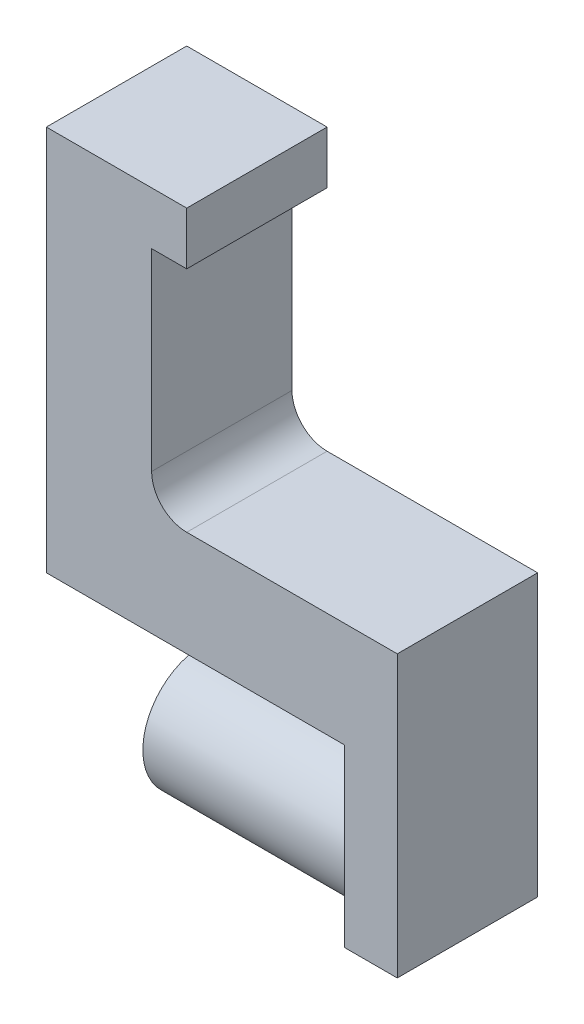
ISO-10303-21;
HEADER;
FILE_DESCRIPTION(('STEP AP214'),'2;1');
FILE_NAME('part.step','',(''),(''),'','','');
FILE_SCHEMA(('AUTOMOTIVE_DESIGN { 1 0 10303 214 1 1 1 1 }'));
ENDSEC;
DATA;
#1=APPLICATION_CONTEXT('core data for automotive mechanical design processes');
#2=APPLICATION_PROTOCOL_DEFINITION('international standard','automotive_design',2000,#1);
#3=PRODUCT_CONTEXT('',#1,'mechanical');
#4=PRODUCT('Part','Part','',(#3));
#5=PRODUCT_RELATED_PRODUCT_CATEGORY('part','',(#4));
#6=PRODUCT_DEFINITION_FORMATION('','',#4);
#7=PRODUCT_DEFINITION_CONTEXT('part definition',#1,'design');
#8=PRODUCT_DEFINITION('design','',#6,#7);
#9=PRODUCT_DEFINITION_SHAPE('','',#8);
#10=(LENGTH_UNIT() NAMED_UNIT(*) SI_UNIT(.MILLI.,.METRE.));
#11=(NAMED_UNIT(*) PLANE_ANGLE_UNIT() SI_UNIT($,.RADIAN.));
#12=(NAMED_UNIT(*) SI_UNIT($,.STERADIAN.) SOLID_ANGLE_UNIT());
#13=UNCERTAINTY_MEASURE_WITH_UNIT(LENGTH_MEASURE(1.E-05),#10,'distance_accuracy_value','');
#14=(GEOMETRIC_REPRESENTATION_CONTEXT(3) GLOBAL_UNCERTAINTY_ASSIGNED_CONTEXT((#13)) GLOBAL_UNIT_ASSIGNED_CONTEXT((#10,
#11,#12)) REPRESENTATION_CONTEXT('',''));
#15=CARTESIAN_POINT('',(0.,0.,0.));
#16=DIRECTION('',(0.,0.,1.));
#17=DIRECTION('',(1.,0.,0.));
#18=AXIS2_PLACEMENT_3D('',#15,#16,#17);
#19=CARTESIAN_POINT('',(-38.1,0.,0.));
#20=DIRECTION('',(1.,0.,0.));
#21=DIRECTION('',(0.,0.,-1.));
#22=AXIS2_PLACEMENT_3D('',#19,#20,#21);
#23=CYLINDRICAL_SURFACE('',#22,11.1125);
#24=CARTESIAN_POINT('',(-38.1,0.,0.));
#25=DIRECTION('',(1.,0.,0.));
#26=DIRECTION('',(0.,0.,-1.));
#27=AXIS2_PLACEMENT_3D('',#24,#25,#26);
#28=CIRCLE('',#27,11.1125);
#29=CARTESIAN_POINT('',(-38.1,0.,-11.1125));
#30=VERTEX_POINT('',#29);
#31=EDGE_CURVE('E217',#30,#30,#28,.T.);
#32=ORIENTED_EDGE('',*,*,#31,.T.);
#33=EDGE_LOOP('',(#32));
#34=FACE_BOUND('',#33,.T.);
#35=CARTESIAN_POINT('',(0.,0.,0.));
#36=DIRECTION('',(1.,0.,0.));
#37=DIRECTION('',(0.,0.,-1.));
#38=AXIS2_PLACEMENT_3D('',#35,#36,#37);
#39=CIRCLE('',#38,11.1125);
#40=CARTESIAN_POINT('',(0.,-11.1125,0.));
#41=VERTEX_POINT('',#40);
#42=EDGE_CURVE('E214',#41,#41,#39,.T.);
#43=ORIENTED_EDGE('',*,*,#42,.F.);
#44=EDGE_LOOP('',(#43));
#45=FACE_BOUND('',#44,.T.);
#46=ADVANCED_FACE('F50',(#34,#45),#23,.T.);
#47=CARTESIAN_POINT('',(-38.1,0.,0.));
#48=DIRECTION('',(1.,0.,0.));
#49=DIRECTION('',(0.,0.,-1.));
#50=AXIS2_PLACEMENT_3D('',#47,#48,#49);
#51=PLANE('',#50);
#52=ORIENTED_EDGE('',*,*,#31,.F.);
#53=EDGE_LOOP('',(#52));
#54=FACE_BOUND('',#53,.T.);
#55=ADVANCED_FACE('F259',(#54),#51,.F.);
#56=CARTESIAN_POINT('',(0.,-11.1125,-12.7));
#57=DIRECTION('',(-1.,0.,0.));
#58=DIRECTION('',(0.,0.,1.));
#59=AXIS2_PLACEMENT_3D('',#56,#57,#58);
#60=PLANE('',#59);
#61=DIRECTION('',(0.,0.,1.));
#62=VECTOR('',#61,1.);
#63=CARTESIAN_POINT('',(0.,-11.1125,-12.7));
#64=LINE('',#63,#62);
#65=CARTESIAN_POINT('',(0.,-11.1125,-12.7));
#66=VERTEX_POINT('',#65);
#67=EDGE_CURVE('E216',#66,#41,#64,.T.);
#68=ORIENTED_EDGE('',*,*,#67,.T.);
#69=ORIENTED_EDGE('',*,*,#42,.T.);
#70=CARTESIAN_POINT('',(0.,-11.1125,12.7));
#71=VERTEX_POINT('',#70);
#72=EDGE_CURVE('E209',#41,#71,#64,.T.);
#73=ORIENTED_EDGE('',*,*,#72,.T.);
#74=DIRECTION('',(0.,-1.,0.));
#75=VECTOR('',#74,1.);
#76=CARTESIAN_POINT('',(0.,-11.1125,12.7));
#77=LINE('',#76,#75);
#78=CARTESIAN_POINT('',(0.,20.6375,12.7));
#79=VERTEX_POINT('',#78);
#80=EDGE_CURVE('E192',#79,#71,#77,.T.);
#81=ORIENTED_EDGE('',*,*,#80,.F.);
#82=DIRECTION('',(0.,0.,1.));
#83=VECTOR('',#82,1.);
#84=CARTESIAN_POINT('',(0.,20.6375,-12.7));
#85=LINE('',#84,#83);
#86=CARTESIAN_POINT('',(0.,20.6375,-12.7));
#87=VERTEX_POINT('',#86);
#88=EDGE_CURVE('E208',#87,#79,#85,.T.);
#89=ORIENTED_EDGE('',*,*,#88,.F.);
#90=DIRECTION('',(0.,-1.,0.));
#91=VECTOR('',#90,1.);
#92=CARTESIAN_POINT('',(0.,-11.1125,-12.7));
#93=LINE('',#92,#91);
#94=EDGE_CURVE('E203',#87,#66,#93,.T.);
#95=ORIENTED_EDGE('',*,*,#94,.T.);
#96=EDGE_LOOP('',(#68,#69,#73,#81,#89,#95));
#97=FACE_BOUND('',#96,.T.);
#98=ADVANCED_FACE('F248',(#97),#60,.T.);
#99=CARTESIAN_POINT('',(9.525,-11.1125,-12.7));
#100=DIRECTION('',(1.,0.,0.));
#101=DIRECTION('',(0.,0.,-1.));
#102=AXIS2_PLACEMENT_3D('',#99,#100,#101);
#103=PLANE('',#102);
#104=DIRECTION('',(0.,1.,0.));
#105=VECTOR('',#104,1.);
#106=CARTESIAN_POINT('',(9.525,-11.1125,-12.7));
#107=LINE('',#106,#105);
#108=CARTESIAN_POINT('',(9.525,-11.1125,-12.7));
#109=VERTEX_POINT('',#108);
#110=CARTESIAN_POINT('',(9.52500000000001,39.6875,-12.7));
#111=VERTEX_POINT('',#110);
#112=EDGE_CURVE('E210',#109,#111,#107,.T.);
#113=ORIENTED_EDGE('',*,*,#112,.T.);
#114=DIRECTION('',(0.,0.,1.));
#115=VECTOR('',#114,1.);
#116=CARTESIAN_POINT('',(9.52500000000001,39.6875,-12.7));
#117=LINE('',#116,#115);
#118=CARTESIAN_POINT('',(9.52500000000001,39.6875,12.7));
#119=VERTEX_POINT('',#118);
#120=EDGE_CURVE('E189',#111,#119,#117,.T.);
#121=ORIENTED_EDGE('',*,*,#120,.T.);
#122=DIRECTION('',(0.,1.,0.));
#123=VECTOR('',#122,1.);
#124=CARTESIAN_POINT('',(9.525,-11.1125,12.7));
#125=LINE('',#124,#123);
#126=CARTESIAN_POINT('',(9.525,-11.1125,12.7));
#127=VERTEX_POINT('',#126);
#128=EDGE_CURVE('E197',#127,#119,#125,.T.);
#129=ORIENTED_EDGE('',*,*,#128,.F.);
#130=DIRECTION('',(0.,0.,1.));
#131=VECTOR('',#130,1.);
#132=CARTESIAN_POINT('',(9.525,-11.1125,-12.7));
#133=LINE('',#132,#131);
#134=EDGE_CURVE('E211',#109,#127,#133,.T.);
#135=ORIENTED_EDGE('',*,*,#134,.F.);
#136=EDGE_LOOP('',(#113,#121,#129,#135));
#137=FACE_BOUND('',#136,.T.);
#138=ADVANCED_FACE('F269',(#137),#103,.T.);
#139=CARTESIAN_POINT('',(0.,-11.1125,-12.7));
#140=DIRECTION('',(0.,-1.,0.));
#141=DIRECTION('',(0.,0.,-1.));
#142=AXIS2_PLACEMENT_3D('',#139,#140,#141);
#143=PLANE('',#142);
#144=ORIENTED_EDGE('',*,*,#134,.T.);
#145=DIRECTION('',(1.,0.,0.));
#146=VECTOR('',#145,1.);
#147=CARTESIAN_POINT('',(0.,-11.1125,12.7));
#148=LINE('',#147,#146);
#149=EDGE_CURVE('E196',#71,#127,#148,.T.);
#150=ORIENTED_EDGE('',*,*,#149,.F.);
#151=ORIENTED_EDGE('',*,*,#72,.F.);
#152=ORIENTED_EDGE('',*,*,#67,.F.);
#153=DIRECTION('',(1.,0.,0.));
#154=VECTOR('',#153,1.);
#155=CARTESIAN_POINT('',(0.,-11.1125,-12.7));
#156=LINE('',#155,#154);
#157=EDGE_CURVE('E204',#66,#109,#156,.T.);
#158=ORIENTED_EDGE('',*,*,#157,.T.);
#159=EDGE_LOOP('',(#144,#150,#151,#152,#158));
#160=FACE_BOUND('',#159,.T.);
#161=ADVANCED_FACE('F254',(#160),#143,.T.);
#162=CARTESIAN_POINT('',(0.,0.,-12.7));
#163=DIRECTION('',(0.,0.,-1.));
#164=DIRECTION('',(-1.,0.,0.));
#165=AXIS2_PLACEMENT_3D('',#162,#163,#164);
#166=PLANE('',#165);
#167=DIRECTION('',(-1.,0.,0.));
#168=VECTOR('',#167,1.);
#169=CARTESIAN_POINT('',(-53.975,90.4875,-12.7));
#170=LINE('',#169,#168);
#171=CARTESIAN_POINT('',(-28.575,90.4875,-12.7));
#172=VERTEX_POINT('',#171);
#173=CARTESIAN_POINT('',(-53.975,90.4875,-12.7));
#174=VERTEX_POINT('',#173);
#175=EDGE_CURVE('E169',#172,#174,#170,.T.);
#176=ORIENTED_EDGE('',*,*,#175,.F.);
#177=DIRECTION('',(0.,1.,0.));
#178=VECTOR('',#177,1.);
#179=CARTESIAN_POINT('',(-28.575,80.9625,-12.7));
#180=LINE('',#179,#178);
#181=CARTESIAN_POINT('',(-28.575,80.9625,-12.7));
#182=VERTEX_POINT('',#181);
#183=EDGE_CURVE('E152',#182,#172,#180,.T.);
#184=ORIENTED_EDGE('',*,*,#183,.F.);
#185=DIRECTION('',(1.,0.,0.));
#186=VECTOR('',#185,1.);
#187=CARTESIAN_POINT('',(-41.23944,80.9625,-12.7));
#188=LINE('',#187,#186);
#189=CARTESIAN_POINT('',(-34.925,80.9625,-12.7));
#190=VERTEX_POINT('',#189);
#191=EDGE_CURVE('E146',#190,#182,#188,.T.);
#192=ORIENTED_EDGE('',*,*,#191,.F.);
#193=DIRECTION('',(0.,1.,0.));
#194=VECTOR('',#193,1.);
#195=CARTESIAN_POINT('',(-34.925,20.6375,-12.7));
#196=LINE('',#195,#194);
#197=CARTESIAN_POINT('',(-34.925,46.0375,-12.7));
#198=VERTEX_POINT('',#197);
#199=EDGE_CURVE('E170',#198,#190,#196,.T.);
#200=ORIENTED_EDGE('',*,*,#199,.F.);
#201=CARTESIAN_POINT('',(-28.575,46.0375,-12.7));
#202=DIRECTION('',(0.,0.,-1.));
#203=DIRECTION('',(-1.,0.,0.));
#204=AXIS2_PLACEMENT_3D('',#201,#202,#203);
#205=CIRCLE('',#204,6.35);
#206=CARTESIAN_POINT('',(-28.575,39.6875,-12.7));
#207=VERTEX_POINT('',#206);
#208=EDGE_CURVE('E54',#198,#207,#205,.F.);
#209=ORIENTED_EDGE('',*,*,#208,.T.);
#210=DIRECTION('',(-1.,0.,0.));
#211=VECTOR('',#210,1.);
#212=CARTESIAN_POINT('',(-53.975,39.6875,-12.7));
#213=LINE('',#212,#211);
#214=EDGE_CURVE('E184',#111,#207,#213,.T.);
#215=ORIENTED_EDGE('',*,*,#214,.F.);
#216=ORIENTED_EDGE('',*,*,#112,.F.);
#217=ORIENTED_EDGE('',*,*,#157,.F.);
#218=ORIENTED_EDGE('',*,*,#94,.F.);
#219=DIRECTION('',(1.,0.,0.));
#220=VECTOR('',#219,1.);
#221=CARTESIAN_POINT('',(-53.975,20.6375,-12.7));
#222=LINE('',#221,#220);
#223=CARTESIAN_POINT('',(-53.975,20.6375,-12.7));
#224=VERTEX_POINT('',#223);
#225=EDGE_CURVE('E182',#224,#87,#222,.T.);
#226=ORIENTED_EDGE('',*,*,#225,.F.);
#227=DIRECTION('',(0.,-1.,0.));
#228=VECTOR('',#227,1.);
#229=CARTESIAN_POINT('',(-53.975,20.6375,-12.7));
#230=LINE('',#229,#228);
#231=EDGE_CURVE('E181',#174,#224,#230,.T.);
#232=ORIENTED_EDGE('',*,*,#231,.F.);
#233=EDGE_LOOP('',(#176,#184,#192,#200,#209,#215,#216,#217,#218,#226,#232));
#234=FACE_BOUND('',#233,.T.);
#235=ADVANCED_FACE('F234',(#234),#166,.T.);
#236=CARTESIAN_POINT('',(0.,0.,12.7));
#237=DIRECTION('',(0.,0.,-1.));
#238=DIRECTION('',(-1.,0.,0.));
#239=AXIS2_PLACEMENT_3D('',#236,#237,#238);
#240=PLANE('',#239);
#241=DIRECTION('',(-1.,0.,0.));
#242=VECTOR('',#241,1.);
#243=CARTESIAN_POINT('',(-53.975,39.6875,12.7));
#244=LINE('',#243,#242);
#245=CARTESIAN_POINT('',(-28.575,39.6875,12.7));
#246=VERTEX_POINT('',#245);
#247=EDGE_CURVE('E177',#119,#246,#244,.T.);
#248=ORIENTED_EDGE('',*,*,#247,.T.);
#249=CARTESIAN_POINT('',(-28.575,46.0375,12.7));
#250=DIRECTION('',(0.,0.,-1.));
#251=DIRECTION('',(-1.,0.,0.));
#252=AXIS2_PLACEMENT_3D('',#249,#250,#251);
#253=CIRCLE('',#252,6.35);
#254=CARTESIAN_POINT('',(-34.925,46.0375,12.7));
#255=VERTEX_POINT('',#254);
#256=EDGE_CURVE('E11',#246,#255,#253,.T.);
#257=ORIENTED_EDGE('',*,*,#256,.T.);
#258=DIRECTION('',(0.,1.,0.));
#259=VECTOR('',#258,1.);
#260=CARTESIAN_POINT('',(-34.925,20.6375,12.7));
#261=LINE('',#260,#259);
#262=CARTESIAN_POINT('',(-34.925,80.9625,12.7));
#263=VERTEX_POINT('',#262);
#264=EDGE_CURVE('E137',#255,#263,#261,.T.);
#265=ORIENTED_EDGE('',*,*,#264,.T.);
#266=DIRECTION('',(1.,0.,0.));
#267=VECTOR('',#266,1.);
#268=CARTESIAN_POINT('',(-41.23944,80.9625,12.7));
#269=LINE('',#268,#267);
#270=CARTESIAN_POINT('',(-28.575,80.9625,12.7));
#271=VERTEX_POINT('',#270);
#272=EDGE_CURVE('E133',#263,#271,#269,.T.);
#273=ORIENTED_EDGE('',*,*,#272,.T.);
#274=DIRECTION('',(0.,1.,0.));
#275=VECTOR('',#274,1.);
#276=CARTESIAN_POINT('',(-28.575,80.9625,12.7));
#277=LINE('',#276,#275);
#278=CARTESIAN_POINT('',(-28.575,90.4875,12.7));
#279=VERTEX_POINT('',#278);
#280=EDGE_CURVE('E136',#271,#279,#277,.T.);
#281=ORIENTED_EDGE('',*,*,#280,.T.);
#282=DIRECTION('',(-1.,0.,0.));
#283=VECTOR('',#282,1.);
#284=CARTESIAN_POINT('',(-53.975,90.4875,12.7));
#285=LINE('',#284,#283);
#286=CARTESIAN_POINT('',(-53.975,90.4875,12.7));
#287=VERTEX_POINT('',#286);
#288=EDGE_CURVE('E164',#279,#287,#285,.T.);
#289=ORIENTED_EDGE('',*,*,#288,.T.);
#290=DIRECTION('',(0.,-1.,0.));
#291=VECTOR('',#290,1.);
#292=CARTESIAN_POINT('',(-53.975,20.6375,12.7));
#293=LINE('',#292,#291);
#294=CARTESIAN_POINT('',(-53.975,20.6375,12.7));
#295=VERTEX_POINT('',#294);
#296=EDGE_CURVE('E174',#287,#295,#293,.T.);
#297=ORIENTED_EDGE('',*,*,#296,.T.);
#298=DIRECTION('',(1.,0.,0.));
#299=VECTOR('',#298,1.);
#300=CARTESIAN_POINT('',(-53.975,20.6375,12.7));
#301=LINE('',#300,#299);
#302=EDGE_CURVE('E180',#295,#79,#301,.T.);
#303=ORIENTED_EDGE('',*,*,#302,.T.);
#304=ORIENTED_EDGE('',*,*,#80,.T.);
#305=ORIENTED_EDGE('',*,*,#149,.T.);
#306=ORIENTED_EDGE('',*,*,#128,.T.);
#307=EDGE_LOOP('',(#248,#257,#265,#273,#281,#289,#297,#303,#304,#305,#306));
#308=FACE_BOUND('',#307,.T.);
#309=ADVANCED_FACE('F134',(#308),#240,.F.);
#310=CARTESIAN_POINT('',(-53.975,20.6375,-12.7));
#311=DIRECTION('',(-1.,0.,0.));
#312=DIRECTION('',(0.,0.,1.));
#313=AXIS2_PLACEMENT_3D('',#310,#311,#312);
#314=PLANE('',#313);
#315=DIRECTION('',(0.,0.,1.));
#316=VECTOR('',#315,1.);
#317=CARTESIAN_POINT('',(-53.975,20.6375,-12.7));
#318=LINE('',#317,#316);
#319=EDGE_CURVE('E190',#224,#295,#318,.T.);
#320=ORIENTED_EDGE('',*,*,#319,.T.);
#321=ORIENTED_EDGE('',*,*,#296,.F.);
#322=DIRECTION('',(0.,0.,1.));
#323=VECTOR('',#322,1.);
#324=CARTESIAN_POINT('',(-53.975,90.4875,-12.7));
#325=LINE('',#324,#323);
#326=EDGE_CURVE('E175',#174,#287,#325,.T.);
#327=ORIENTED_EDGE('',*,*,#326,.F.);
#328=ORIENTED_EDGE('',*,*,#231,.T.);
#329=EDGE_LOOP('',(#320,#321,#327,#328));
#330=FACE_BOUND('',#329,.T.);
#331=ADVANCED_FACE('F243',(#330),#314,.T.);
#332=CARTESIAN_POINT('',(-53.975,39.6875,-12.7));
#333=DIRECTION('',(0.,1.,0.));
#334=DIRECTION('',(0.,0.,1.));
#335=AXIS2_PLACEMENT_3D('',#332,#333,#334);
#336=PLANE('',#335);
#337=ORIENTED_EDGE('',*,*,#214,.T.);
#338=DIRECTION('',(0.,0.,-1.));
#339=VECTOR('',#338,1.);
#340=CARTESIAN_POINT('',(-28.575,39.6875,12.7));
#341=LINE('',#340,#339);
#342=EDGE_CURVE('E68',#207,#246,#341,.F.);
#343=ORIENTED_EDGE('',*,*,#342,.T.);
#344=ORIENTED_EDGE('',*,*,#247,.F.);
#345=ORIENTED_EDGE('',*,*,#120,.F.);
#346=EDGE_LOOP('',(#337,#343,#344,#345));
#347=FACE_BOUND('',#346,.T.);
#348=ADVANCED_FACE('F278',(#347),#336,.T.);
#349=CARTESIAN_POINT('',(-53.975,20.6375,-12.7));
#350=DIRECTION('',(0.,-1.,0.));
#351=DIRECTION('',(0.,0.,-1.));
#352=AXIS2_PLACEMENT_3D('',#349,#350,#351);
#353=PLANE('',#352);
#354=ORIENTED_EDGE('',*,*,#88,.T.);
#355=ORIENTED_EDGE('',*,*,#302,.F.);
#356=ORIENTED_EDGE('',*,*,#319,.F.);
#357=ORIENTED_EDGE('',*,*,#225,.T.);
#358=EDGE_LOOP('',(#354,#355,#356,#357));
#359=FACE_BOUND('',#358,.T.);
#360=ADVANCED_FACE('F244',(#359),#353,.T.);
#361=CARTESIAN_POINT('',(-53.975,90.4875,-12.7));
#362=DIRECTION('',(0.,1.,0.));
#363=DIRECTION('',(0.,0.,1.));
#364=AXIS2_PLACEMENT_3D('',#361,#362,#363);
#365=PLANE('',#364);
#366=ORIENTED_EDGE('',*,*,#326,.T.);
#367=ORIENTED_EDGE('',*,*,#288,.F.);
#368=DIRECTION('',(0.,0.,1.));
#369=VECTOR('',#368,1.);
#370=CARTESIAN_POINT('',(-28.575,90.4875,-12.7));
#371=LINE('',#370,#369);
#372=EDGE_CURVE('E153',#172,#279,#371,.T.);
#373=ORIENTED_EDGE('',*,*,#372,.F.);
#374=ORIENTED_EDGE('',*,*,#175,.T.);
#375=EDGE_LOOP('',(#366,#367,#373,#374));
#376=FACE_BOUND('',#375,.T.);
#377=ADVANCED_FACE('F238',(#376),#365,.T.);
#378=CARTESIAN_POINT('',(-34.925,20.6375,-12.7));
#379=DIRECTION('',(1.,0.,0.));
#380=DIRECTION('',(0.,0.,-1.));
#381=AXIS2_PLACEMENT_3D('',#378,#379,#380);
#382=PLANE('',#381);
#383=ORIENTED_EDGE('',*,*,#264,.F.);
#384=DIRECTION('',(0.,0.,-1.));
#385=VECTOR('',#384,1.);
#386=CARTESIAN_POINT('',(-34.925,46.0375,-12.7));
#387=LINE('',#386,#385);
#388=EDGE_CURVE('E228',#255,#198,#387,.T.);
#389=ORIENTED_EDGE('',*,*,#388,.T.);
#390=ORIENTED_EDGE('',*,*,#199,.T.);
#391=DIRECTION('',(0.,0.,-1.));
#392=VECTOR('',#391,1.);
#393=CARTESIAN_POINT('',(-34.925,80.9625,-12.7));
#394=LINE('',#393,#392);
#395=EDGE_CURVE('E225',#263,#190,#394,.T.);
#396=ORIENTED_EDGE('',*,*,#395,.F.);
#397=EDGE_LOOP('',(#383,#389,#390,#396));
#398=FACE_BOUND('',#397,.T.);
#399=ADVANCED_FACE('F233',(#398),#382,.T.);
#400=CARTESIAN_POINT('',(-28.575,80.9625,-12.7));
#401=DIRECTION('',(1.,0.,0.));
#402=DIRECTION('',(0.,0.,-1.));
#403=AXIS2_PLACEMENT_3D('',#400,#401,#402);
#404=PLANE('',#403);
#405=ORIENTED_EDGE('',*,*,#372,.T.);
#406=ORIENTED_EDGE('',*,*,#280,.F.);
#407=DIRECTION('',(0.,0.,1.));
#408=VECTOR('',#407,1.);
#409=CARTESIAN_POINT('',(-28.575,80.9625,-12.7));
#410=LINE('',#409,#408);
#411=EDGE_CURVE('E147',#182,#271,#410,.T.);
#412=ORIENTED_EDGE('',*,*,#411,.F.);
#413=ORIENTED_EDGE('',*,*,#183,.T.);
#414=EDGE_LOOP('',(#405,#406,#412,#413));
#415=FACE_BOUND('',#414,.T.);
#416=ADVANCED_FACE('F160',(#415),#404,.T.);
#417=CARTESIAN_POINT('',(-41.23944,80.9625,-12.7));
#418=DIRECTION('',(0.,-1.,0.));
#419=DIRECTION('',(0.,0.,-1.));
#420=AXIS2_PLACEMENT_3D('',#417,#418,#419);
#421=PLANE('',#420);
#422=ORIENTED_EDGE('',*,*,#272,.F.);
#423=ORIENTED_EDGE('',*,*,#395,.T.);
#424=ORIENTED_EDGE('',*,*,#191,.T.);
#425=ORIENTED_EDGE('',*,*,#411,.T.);
#426=EDGE_LOOP('',(#422,#423,#424,#425));
#427=FACE_BOUND('',#426,.T.);
#428=ADVANCED_FACE('F150',(#427),#421,.T.);
#429=CARTESIAN_POINT('',(-28.575,46.0375,-12.7));
#430=DIRECTION('',(0.,0.,1.));
#431=DIRECTION('',(1.,0.,0.));
#432=AXIS2_PLACEMENT_3D('',#429,#430,#431);
#433=CYLINDRICAL_SURFACE('',#432,6.35);
#434=ORIENTED_EDGE('',*,*,#256,.F.);
#435=ORIENTED_EDGE('',*,*,#342,.F.);
#436=ORIENTED_EDGE('',*,*,#208,.F.);
#437=ORIENTED_EDGE('',*,*,#388,.F.);
#438=EDGE_LOOP('',(#434,#435,#436,#437));
#439=FACE_BOUND('',#438,.T.);
#440=ADVANCED_FACE('F47',(#439),#433,.F.);
#441=CLOSED_SHELL('',(#46,#55,#98,#138,#161,#235,#309,#331,#348,#360,#377,#399,#416,#428,#440));
#442=MANIFOLD_SOLID_BREP('B2',#441);
#443=ADVANCED_BREP_SHAPE_REPRESENTATION('',(#18,#442),#14);
#444=SHAPE_DEFINITION_REPRESENTATION(#9,#443);
ENDSEC;
END-ISO-10303-21;
